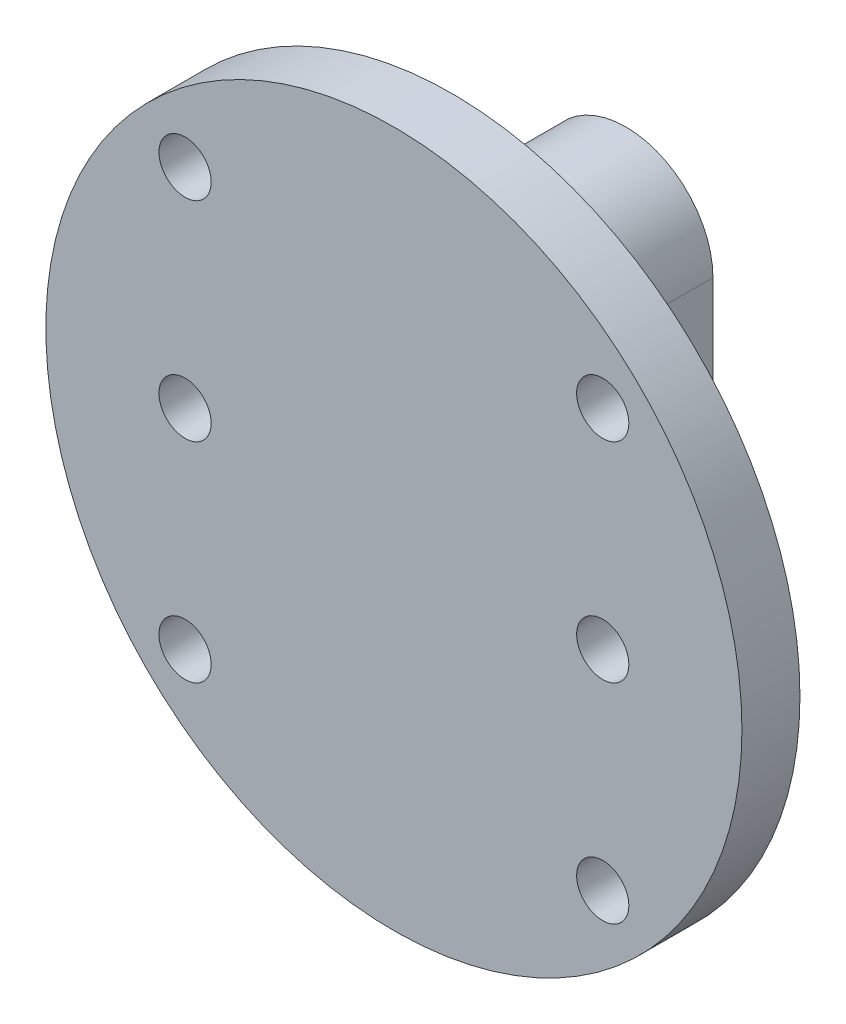
ISO-10303-21;
HEADER;
FILE_DESCRIPTION(('STEP AP214'),'2;1');
FILE_NAME('part.step','',(''),(''),'','','');
FILE_SCHEMA(('AUTOMOTIVE_DESIGN { 1 0 10303 214 1 1 1 1 }'));
ENDSEC;
DATA;
#1=APPLICATION_CONTEXT('core data for automotive mechanical design processes');
#2=APPLICATION_PROTOCOL_DEFINITION('international standard','automotive_design',2000,#1);
#3=PRODUCT_CONTEXT('',#1,'mechanical');
#4=PRODUCT('Part','Part','',(#3));
#5=PRODUCT_RELATED_PRODUCT_CATEGORY('part','',(#4));
#6=PRODUCT_DEFINITION_FORMATION('','',#4);
#7=PRODUCT_DEFINITION_CONTEXT('part definition',#1,'design');
#8=PRODUCT_DEFINITION('design','',#6,#7);
#9=PRODUCT_DEFINITION_SHAPE('','',#8);
#10=(LENGTH_UNIT() NAMED_UNIT(*) SI_UNIT(.MILLI.,.METRE.));
#11=(NAMED_UNIT(*) PLANE_ANGLE_UNIT() SI_UNIT($,.RADIAN.));
#12=(NAMED_UNIT(*) SI_UNIT($,.STERADIAN.) SOLID_ANGLE_UNIT());
#13=UNCERTAINTY_MEASURE_WITH_UNIT(LENGTH_MEASURE(1.E-05),#10,'distance_accuracy_value','');
#14=(GEOMETRIC_REPRESENTATION_CONTEXT(3) GLOBAL_UNCERTAINTY_ASSIGNED_CONTEXT((#13)) GLOBAL_UNIT_ASSIGNED_CONTEXT((#10,
#11,#12)) REPRESENTATION_CONTEXT('',''));
#15=CARTESIAN_POINT('',(0.,0.,0.));
#16=DIRECTION('',(0.,0.,1.));
#17=DIRECTION('',(1.,0.,0.));
#18=AXIS2_PLACEMENT_3D('',#15,#16,#17);
#19=CARTESIAN_POINT('',(0.,0.,5.));
#20=DIRECTION('',(0.,0.,1.));
#21=DIRECTION('',(1.,0.,0.));
#22=AXIS2_PLACEMENT_3D('',#19,#20,#21);
#23=PLANE('',#22);
#24=CARTESIAN_POINT('',(18.,-18.,5.));
#25=DIRECTION('',(0.,0.,1.));
#26=DIRECTION('',(1.,0.,0.));
#27=AXIS2_PLACEMENT_3D('',#24,#25,#26);
#28=CIRCLE('',#27,2.25);
#29=CARTESIAN_POINT('',(20.25,-18.,5.));
#30=VERTEX_POINT('',#29);
#31=EDGE_CURVE('E111',#30,#30,#28,.T.);
#32=ORIENTED_EDGE('',*,*,#31,.F.);
#33=EDGE_LOOP('',(#32));
#34=FACE_BOUND('',#33,.T.);
#35=CARTESIAN_POINT('',(-18.,18.,5.));
#36=DIRECTION('',(0.,0.,1.));
#37=DIRECTION('',(1.,0.,0.));
#38=AXIS2_PLACEMENT_3D('',#35,#36,#37);
#39=CIRCLE('',#38,2.25);
#40=CARTESIAN_POINT('',(-15.75,18.,5.));
#41=VERTEX_POINT('',#40);
#42=EDGE_CURVE('E123',#41,#41,#39,.T.);
#43=ORIENTED_EDGE('',*,*,#42,.F.);
#44=EDGE_LOOP('',(#43));
#45=FACE_BOUND('',#44,.T.);
#46=CARTESIAN_POINT('',(-18.,0.,5.));
#47=DIRECTION('',(0.,0.,1.));
#48=DIRECTION('',(1.,0.,0.));
#49=AXIS2_PLACEMENT_3D('',#46,#47,#48);
#50=CIRCLE('',#49,2.25);
#51=CARTESIAN_POINT('',(-15.75,0.,5.));
#52=VERTEX_POINT('',#51);
#53=EDGE_CURVE('E135',#52,#52,#50,.T.);
#54=ORIENTED_EDGE('',*,*,#53,.F.);
#55=EDGE_LOOP('',(#54));
#56=FACE_BOUND('',#55,.T.);
#57=CARTESIAN_POINT('',(0.,0.,5.));
#58=DIRECTION('',(0.,0.,1.));
#59=DIRECTION('',(1.,0.,0.));
#60=AXIS2_PLACEMENT_3D('',#57,#58,#59);
#61=CIRCLE('',#60,30.);
#62=CARTESIAN_POINT('',(30.,0.,5.));
#63=VERTEX_POINT('',#62);
#64=EDGE_CURVE('E11',#63,#63,#61,.T.);
#65=ORIENTED_EDGE('',*,*,#64,.T.);
#66=EDGE_LOOP('',(#65));
#67=FACE_BOUND('',#66,.T.);
#68=CARTESIAN_POINT('',(18.,18.,5.));
#69=DIRECTION('',(0.,0.,1.));
#70=DIRECTION('',(1.,0.,0.));
#71=AXIS2_PLACEMENT_3D('',#68,#69,#70);
#72=CIRCLE('',#71,2.25);
#73=CARTESIAN_POINT('',(20.25,18.,5.));
#74=VERTEX_POINT('',#73);
#75=EDGE_CURVE('E129',#74,#74,#72,.T.);
#76=ORIENTED_EDGE('',*,*,#75,.F.);
#77=EDGE_LOOP('',(#76));
#78=FACE_BOUND('',#77,.T.);
#79=CARTESIAN_POINT('',(-18.,-18.,5.));
#80=DIRECTION('',(0.,0.,1.));
#81=DIRECTION('',(1.,0.,0.));
#82=AXIS2_PLACEMENT_3D('',#79,#80,#81);
#83=CIRCLE('',#82,2.25);
#84=CARTESIAN_POINT('',(-15.75,-18.,5.));
#85=VERTEX_POINT('',#84);
#86=EDGE_CURVE('E117',#85,#85,#83,.T.);
#87=ORIENTED_EDGE('',*,*,#86,.F.);
#88=EDGE_LOOP('',(#87));
#89=FACE_BOUND('',#88,.T.);
#90=CARTESIAN_POINT('',(18.,0.,5.));
#91=DIRECTION('',(0.,0.,1.));
#92=DIRECTION('',(1.,0.,0.));
#93=AXIS2_PLACEMENT_3D('',#90,#91,#92);
#94=CIRCLE('',#93,2.25);
#95=CARTESIAN_POINT('',(20.25,0.,5.));
#96=VERTEX_POINT('',#95);
#97=EDGE_CURVE('E102',#96,#96,#94,.T.);
#98=ORIENTED_EDGE('',*,*,#97,.F.);
#99=EDGE_LOOP('',(#98));
#100=FACE_BOUND('',#99,.T.);
#101=ADVANCED_FACE('F37',(#34,#45,#56,#67,#78,#89,#100),#23,.T.);
#102=CARTESIAN_POINT('',(0.,0.,0.));
#103=DIRECTION('',(0.,0.,1.));
#104=DIRECTION('',(1.,0.,0.));
#105=AXIS2_PLACEMENT_3D('',#102,#103,#104);
#106=PLANE('',#105);
#107=CARTESIAN_POINT('',(0.,12.5,0.));
#108=DIRECTION('',(0.,0.,-1.));
#109=DIRECTION('',(-1.,0.,0.));
#110=AXIS2_PLACEMENT_3D('',#107,#108,#109);
#111=CIRCLE('',#110,7.5);
#112=CARTESIAN_POINT('',(-7.5,12.5,0.));
#113=VERTEX_POINT('',#112);
#114=CARTESIAN_POINT('',(7.50000000000001,12.5,0.));
#115=VERTEX_POINT('',#114);
#116=EDGE_CURVE('E52',#113,#115,#111,.T.);
#117=ORIENTED_EDGE('',*,*,#116,.F.);
#118=DIRECTION('',(0.,1.,0.));
#119=VECTOR('',#118,1.);
#120=CARTESIAN_POINT('',(-7.5,12.5,0.));
#121=LINE('',#120,#119);
#122=CARTESIAN_POINT('',(-7.5,-12.5,0.));
#123=VERTEX_POINT('',#122);
#124=EDGE_CURVE('E56',#123,#113,#121,.T.);
#125=ORIENTED_EDGE('',*,*,#124,.F.);
#126=CARTESIAN_POINT('',(0.,-12.5,0.));
#127=DIRECTION('',(0.,0.,-1.));
#128=DIRECTION('',(-1.,0.,0.));
#129=AXIS2_PLACEMENT_3D('',#126,#127,#128);
#130=CIRCLE('',#129,7.5);
#131=CARTESIAN_POINT('',(7.5,-12.5,0.));
#132=VERTEX_POINT('',#131);
#133=EDGE_CURVE('E337',#132,#123,#130,.T.);
#134=ORIENTED_EDGE('',*,*,#133,.F.);
#135=DIRECTION('',(0.,-1.,0.));
#136=VECTOR('',#135,1.);
#137=CARTESIAN_POINT('',(7.50000000000001,12.5,0.));
#138=LINE('',#137,#136);
#139=EDGE_CURVE('E335',#115,#132,#138,.T.);
#140=ORIENTED_EDGE('',*,*,#139,.F.);
#141=EDGE_LOOP('',(#117,#125,#134,#140));
#142=FACE_BOUND('',#141,.T.);
#143=CARTESIAN_POINT('',(0.,0.,0.));
#144=DIRECTION('',(0.,0.,1.));
#145=DIRECTION('',(1.,0.,0.));
#146=AXIS2_PLACEMENT_3D('',#143,#144,#145);
#147=CIRCLE('',#146,30.);
#148=CARTESIAN_POINT('',(30.,0.,0.));
#149=VERTEX_POINT('',#148);
#150=EDGE_CURVE('E41',#149,#149,#147,.T.);
#151=ORIENTED_EDGE('',*,*,#150,.F.);
#152=EDGE_LOOP('',(#151));
#153=FACE_BOUND('',#152,.T.);
#154=CARTESIAN_POINT('',(-18.,0.,0.));
#155=DIRECTION('',(0.,0.,1.));
#156=DIRECTION('',(1.,0.,0.));
#157=AXIS2_PLACEMENT_3D('',#154,#155,#156);
#158=CIRCLE('',#157,2.25);
#159=CARTESIAN_POINT('',(-15.75,0.,0.));
#160=VERTEX_POINT('',#159);
#161=EDGE_CURVE('E132',#160,#160,#158,.T.);
#162=ORIENTED_EDGE('',*,*,#161,.T.);
#163=EDGE_LOOP('',(#162));
#164=FACE_BOUND('',#163,.T.);
#165=CARTESIAN_POINT('',(18.,18.,0.));
#166=DIRECTION('',(0.,0.,1.));
#167=DIRECTION('',(1.,0.,0.));
#168=AXIS2_PLACEMENT_3D('',#165,#166,#167);
#169=CIRCLE('',#168,2.25);
#170=CARTESIAN_POINT('',(20.25,18.,0.));
#171=VERTEX_POINT('',#170);
#172=EDGE_CURVE('E126',#171,#171,#169,.T.);
#173=ORIENTED_EDGE('',*,*,#172,.T.);
#174=EDGE_LOOP('',(#173));
#175=FACE_BOUND('',#174,.T.);
#176=CARTESIAN_POINT('',(-18.,18.,0.));
#177=DIRECTION('',(0.,0.,1.));
#178=DIRECTION('',(1.,0.,0.));
#179=AXIS2_PLACEMENT_3D('',#176,#177,#178);
#180=CIRCLE('',#179,2.25);
#181=CARTESIAN_POINT('',(-15.75,18.,0.));
#182=VERTEX_POINT('',#181);
#183=EDGE_CURVE('E120',#182,#182,#180,.T.);
#184=ORIENTED_EDGE('',*,*,#183,.T.);
#185=EDGE_LOOP('',(#184));
#186=FACE_BOUND('',#185,.T.);
#187=CARTESIAN_POINT('',(-18.,-18.,0.));
#188=DIRECTION('',(0.,0.,1.));
#189=DIRECTION('',(1.,0.,0.));
#190=AXIS2_PLACEMENT_3D('',#187,#188,#189);
#191=CIRCLE('',#190,2.25);
#192=CARTESIAN_POINT('',(-15.75,-18.,0.));
#193=VERTEX_POINT('',#192);
#194=EDGE_CURVE('E114',#193,#193,#191,.T.);
#195=ORIENTED_EDGE('',*,*,#194,.T.);
#196=EDGE_LOOP('',(#195));
#197=FACE_BOUND('',#196,.T.);
#198=CARTESIAN_POINT('',(18.,-18.,0.));
#199=DIRECTION('',(0.,0.,1.));
#200=DIRECTION('',(1.,0.,0.));
#201=AXIS2_PLACEMENT_3D('',#198,#199,#200);
#202=CIRCLE('',#201,2.25);
#203=CARTESIAN_POINT('',(20.25,-18.,0.));
#204=VERTEX_POINT('',#203);
#205=EDGE_CURVE('E109',#204,#204,#202,.T.);
#206=ORIENTED_EDGE('',*,*,#205,.T.);
#207=EDGE_LOOP('',(#206));
#208=FACE_BOUND('',#207,.T.);
#209=CARTESIAN_POINT('',(18.,0.,0.));
#210=DIRECTION('',(0.,0.,1.));
#211=DIRECTION('',(1.,0.,0.));
#212=AXIS2_PLACEMENT_3D('',#209,#210,#211);
#213=CIRCLE('',#212,2.25);
#214=CARTESIAN_POINT('',(20.25,0.,0.));
#215=VERTEX_POINT('',#214);
#216=EDGE_CURVE('E99',#215,#215,#213,.T.);
#217=ORIENTED_EDGE('',*,*,#216,.T.);
#218=EDGE_LOOP('',(#217));
#219=FACE_BOUND('',#218,.T.);
#220=ADVANCED_FACE('F141',(#142,#153,#164,#175,#186,#197,#208,#219),#106,.F.);
#221=CARTESIAN_POINT('',(0.,0.,5.));
#222=DIRECTION('',(0.,0.,-1.));
#223=DIRECTION('',(-1.,0.,0.));
#224=AXIS2_PLACEMENT_3D('',#221,#222,#223);
#225=CYLINDRICAL_SURFACE('',#224,30.);
#226=ORIENTED_EDGE('',*,*,#64,.F.);
#227=EDGE_LOOP('',(#226));
#228=FACE_BOUND('',#227,.T.);
#229=ORIENTED_EDGE('',*,*,#150,.T.);
#230=EDGE_LOOP('',(#229));
#231=FACE_BOUND('',#230,.T.);
#232=ADVANCED_FACE('F39',(#228,#231),#225,.T.);
#233=CARTESIAN_POINT('',(-18.,0.,5.));
#234=DIRECTION('',(0.,0.,-1.));
#235=DIRECTION('',(-1.,0.,0.));
#236=AXIS2_PLACEMENT_3D('',#233,#234,#235);
#237=CYLINDRICAL_SURFACE('',#236,2.25);
#238=ORIENTED_EDGE('',*,*,#53,.T.);
#239=EDGE_LOOP('',(#238));
#240=FACE_BOUND('',#239,.T.);
#241=ORIENTED_EDGE('',*,*,#161,.F.);
#242=EDGE_LOOP('',(#241));
#243=FACE_BOUND('',#242,.T.);
#244=ADVANCED_FACE('F144',(#240,#243),#237,.F.);
#245=CARTESIAN_POINT('',(18.,18.,5.));
#246=DIRECTION('',(0.,0.,-1.));
#247=DIRECTION('',(-1.,0.,0.));
#248=AXIS2_PLACEMENT_3D('',#245,#246,#247);
#249=CYLINDRICAL_SURFACE('',#248,2.25);
#250=ORIENTED_EDGE('',*,*,#75,.T.);
#251=EDGE_LOOP('',(#250));
#252=FACE_BOUND('',#251,.T.);
#253=ORIENTED_EDGE('',*,*,#172,.F.);
#254=EDGE_LOOP('',(#253));
#255=FACE_BOUND('',#254,.T.);
#256=ADVANCED_FACE('F146',(#252,#255),#249,.F.);
#257=CARTESIAN_POINT('',(-18.,18.,5.));
#258=DIRECTION('',(0.,0.,-1.));
#259=DIRECTION('',(-1.,0.,0.));
#260=AXIS2_PLACEMENT_3D('',#257,#258,#259);
#261=CYLINDRICAL_SURFACE('',#260,2.25);
#262=ORIENTED_EDGE('',*,*,#42,.T.);
#263=EDGE_LOOP('',(#262));
#264=FACE_BOUND('',#263,.T.);
#265=ORIENTED_EDGE('',*,*,#183,.F.);
#266=EDGE_LOOP('',(#265));
#267=FACE_BOUND('',#266,.T.);
#268=ADVANCED_FACE('F153',(#264,#267),#261,.F.);
#269=CARTESIAN_POINT('',(-18.,-18.,5.));
#270=DIRECTION('',(0.,0.,-1.));
#271=DIRECTION('',(-1.,0.,0.));
#272=AXIS2_PLACEMENT_3D('',#269,#270,#271);
#273=CYLINDRICAL_SURFACE('',#272,2.25);
#274=ORIENTED_EDGE('',*,*,#86,.T.);
#275=EDGE_LOOP('',(#274));
#276=FACE_BOUND('',#275,.T.);
#277=ORIENTED_EDGE('',*,*,#194,.F.);
#278=EDGE_LOOP('',(#277));
#279=FACE_BOUND('',#278,.T.);
#280=ADVANCED_FACE('F192',(#276,#279),#273,.F.);
#281=CARTESIAN_POINT('',(18.,-18.,5.));
#282=DIRECTION('',(0.,0.,-1.));
#283=DIRECTION('',(-1.,0.,0.));
#284=AXIS2_PLACEMENT_3D('',#281,#282,#283);
#285=CYLINDRICAL_SURFACE('',#284,2.25);
#286=ORIENTED_EDGE('',*,*,#31,.T.);
#287=EDGE_LOOP('',(#286));
#288=FACE_BOUND('',#287,.T.);
#289=ORIENTED_EDGE('',*,*,#205,.F.);
#290=EDGE_LOOP('',(#289));
#291=FACE_BOUND('',#290,.T.);
#292=ADVANCED_FACE('F182',(#288,#291),#285,.F.);
#293=CARTESIAN_POINT('',(18.,0.,5.));
#294=DIRECTION('',(0.,0.,-1.));
#295=DIRECTION('',(-1.,0.,0.));
#296=AXIS2_PLACEMENT_3D('',#293,#294,#295);
#297=CYLINDRICAL_SURFACE('',#296,2.25);
#298=ORIENTED_EDGE('',*,*,#97,.T.);
#299=EDGE_LOOP('',(#298));
#300=FACE_BOUND('',#299,.T.);
#301=ORIENTED_EDGE('',*,*,#216,.F.);
#302=EDGE_LOOP('',(#301));
#303=FACE_BOUND('',#302,.T.);
#304=ADVANCED_FACE('F179',(#300,#303),#297,.F.);
#305=CARTESIAN_POINT('',(0.,12.5,-15.));
#306=DIRECTION('',(0.,0.,-1.));
#307=DIRECTION('',(-1.,0.,0.));
#308=AXIS2_PLACEMENT_3D('',#305,#306,#307);
#309=PLANE('',#308);
#310=CARTESIAN_POINT('',(0.,12.5,-15.));
#311=DIRECTION('',(0.,0.,-1.));
#312=DIRECTION('',(-1.,0.,0.));
#313=AXIS2_PLACEMENT_3D('',#310,#311,#312);
#314=CIRCLE('',#313,2.8);
#315=CARTESIAN_POINT('',(-2.8,12.5,-15.));
#316=VERTEX_POINT('',#315);
#317=EDGE_CURVE('E326',#316,#316,#314,.T.);
#318=ORIENTED_EDGE('',*,*,#317,.F.);
#319=EDGE_LOOP('',(#318));
#320=FACE_BOUND('',#319,.T.);
#321=CARTESIAN_POINT('',(0.,12.5,-15.));
#322=DIRECTION('',(0.,0.,-1.));
#323=DIRECTION('',(-1.,0.,0.));
#324=AXIS2_PLACEMENT_3D('',#321,#322,#323);
#325=CIRCLE('',#324,7.5);
#326=CARTESIAN_POINT('',(-7.5,12.5,-15.));
#327=VERTEX_POINT('',#326);
#328=CARTESIAN_POINT('',(7.50000000000001,12.5,-15.));
#329=VERTEX_POINT('',#328);
#330=EDGE_CURVE('E87',#327,#329,#325,.T.);
#331=ORIENTED_EDGE('',*,*,#330,.T.);
#332=DIRECTION('',(0.,-1.,0.));
#333=VECTOR('',#332,1.);
#334=CARTESIAN_POINT('',(7.50000000000001,12.5,-15.));
#335=LINE('',#334,#333);
#336=CARTESIAN_POINT('',(7.5,-12.5,-15.));
#337=VERTEX_POINT('',#336);
#338=EDGE_CURVE('E76',#329,#337,#335,.T.);
#339=ORIENTED_EDGE('',*,*,#338,.T.);
#340=CARTESIAN_POINT('',(0.,-12.5,-15.));
#341=DIRECTION('',(0.,0.,-1.));
#342=DIRECTION('',(-1.,0.,0.));
#343=AXIS2_PLACEMENT_3D('',#340,#341,#342);
#344=CIRCLE('',#343,7.5);
#345=CARTESIAN_POINT('',(-7.5,-12.5,-15.));
#346=VERTEX_POINT('',#345);
#347=EDGE_CURVE('E86',#337,#346,#344,.T.);
#348=ORIENTED_EDGE('',*,*,#347,.T.);
#349=DIRECTION('',(0.,1.,0.));
#350=VECTOR('',#349,1.);
#351=CARTESIAN_POINT('',(-7.5,12.5,-15.));
#352=LINE('',#351,#350);
#353=EDGE_CURVE('E93',#346,#327,#352,.T.);
#354=ORIENTED_EDGE('',*,*,#353,.T.);
#355=EDGE_LOOP('',(#331,#339,#348,#354));
#356=FACE_BOUND('',#355,.T.);
#357=CARTESIAN_POINT('',(0.,-12.5,-15.));
#358=DIRECTION('',(0.,0.,-1.));
#359=DIRECTION('',(-1.,0.,0.));
#360=AXIS2_PLACEMENT_3D('',#357,#358,#359);
#361=CIRCLE('',#360,2.8);
#362=CARTESIAN_POINT('',(-2.8,-12.5,-15.));
#363=VERTEX_POINT('',#362);
#364=EDGE_CURVE('E320',#363,#363,#361,.T.);
#365=ORIENTED_EDGE('',*,*,#364,.F.);
#366=EDGE_LOOP('',(#365));
#367=FACE_BOUND('',#366,.T.);
#368=ADVANCED_FACE('F90',(#320,#356,#367),#309,.T.);
#369=CARTESIAN_POINT('',(0.,12.5,-15.));
#370=DIRECTION('',(0.,0.,1.));
#371=DIRECTION('',(1.,0.,0.));
#372=AXIS2_PLACEMENT_3D('',#369,#370,#371);
#373=CYLINDRICAL_SURFACE('',#372,7.5);
#374=ORIENTED_EDGE('',*,*,#116,.T.);
#375=DIRECTION('',(0.,0.,1.));
#376=VECTOR('',#375,1.);
#377=CARTESIAN_POINT('',(7.50000000000001,12.5,-15.));
#378=LINE('',#377,#376);
#379=EDGE_CURVE('E81',#329,#115,#378,.T.);
#380=ORIENTED_EDGE('',*,*,#379,.F.);
#381=ORIENTED_EDGE('',*,*,#330,.F.);
#382=DIRECTION('',(0.,0.,1.));
#383=VECTOR('',#382,1.);
#384=CARTESIAN_POINT('',(-7.5,12.5,-15.));
#385=LINE('',#384,#383);
#386=EDGE_CURVE('E333',#327,#113,#385,.T.);
#387=ORIENTED_EDGE('',*,*,#386,.T.);
#388=EDGE_LOOP('',(#374,#380,#381,#387));
#389=FACE_BOUND('',#388,.T.);
#390=ADVANCED_FACE('F98',(#389),#373,.T.);
#391=CARTESIAN_POINT('',(7.50000000000001,12.5,-15.));
#392=DIRECTION('',(-1.,0.,0.));
#393=DIRECTION('',(0.,-1.,0.));
#394=AXIS2_PLACEMENT_3D('',#391,#392,#393);
#395=PLANE('',#394);
#396=ORIENTED_EDGE('',*,*,#139,.T.);
#397=DIRECTION('',(0.,0.,1.));
#398=VECTOR('',#397,1.);
#399=CARTESIAN_POINT('',(7.5,-12.5,-15.));
#400=LINE('',#399,#398);
#401=EDGE_CURVE('E83',#337,#132,#400,.T.);
#402=ORIENTED_EDGE('',*,*,#401,.F.);
#403=ORIENTED_EDGE('',*,*,#338,.F.);
#404=ORIENTED_EDGE('',*,*,#379,.T.);
#405=EDGE_LOOP('',(#396,#402,#403,#404));
#406=FACE_BOUND('',#405,.T.);
#407=ADVANCED_FACE('F79',(#406),#395,.F.);
#408=CARTESIAN_POINT('',(0.,-12.5,-15.));
#409=DIRECTION('',(0.,0.,1.));
#410=DIRECTION('',(1.,0.,0.));
#411=AXIS2_PLACEMENT_3D('',#408,#409,#410);
#412=CYLINDRICAL_SURFACE('',#411,7.5);
#413=ORIENTED_EDGE('',*,*,#133,.T.);
#414=DIRECTION('',(0.,0.,1.));
#415=VECTOR('',#414,1.);
#416=CARTESIAN_POINT('',(-7.5,-12.5,-15.));
#417=LINE('',#416,#415);
#418=EDGE_CURVE('E104',#346,#123,#417,.T.);
#419=ORIENTED_EDGE('',*,*,#418,.F.);
#420=ORIENTED_EDGE('',*,*,#347,.F.);
#421=ORIENTED_EDGE('',*,*,#401,.T.);
#422=EDGE_LOOP('',(#413,#419,#420,#421));
#423=FACE_BOUND('',#422,.T.);
#424=ADVANCED_FACE('F260',(#423),#412,.T.);
#425=CARTESIAN_POINT('',(-7.5,12.5,-15.));
#426=DIRECTION('',(1.,0.,0.));
#427=DIRECTION('',(0.,1.,0.));
#428=AXIS2_PLACEMENT_3D('',#425,#426,#427);
#429=PLANE('',#428);
#430=ORIENTED_EDGE('',*,*,#124,.T.);
#431=ORIENTED_EDGE('',*,*,#386,.F.);
#432=ORIENTED_EDGE('',*,*,#353,.F.);
#433=ORIENTED_EDGE('',*,*,#418,.T.);
#434=EDGE_LOOP('',(#430,#431,#432,#433));
#435=FACE_BOUND('',#434,.T.);
#436=ADVANCED_FACE('F268',(#435),#429,.F.);
#437=CARTESIAN_POINT('',(0.,12.5,-15.));
#438=DIRECTION('',(0.,0.,1.));
#439=DIRECTION('',(1.,0.,0.));
#440=AXIS2_PLACEMENT_3D('',#437,#438,#439);
#441=CYLINDRICAL_SURFACE('',#440,2.8);
#442=ORIENTED_EDGE('',*,*,#317,.T.);
#443=EDGE_LOOP('',(#442));
#444=FACE_BOUND('',#443,.T.);
#445=CARTESIAN_POINT('',(0.,12.5,0.));
#446=DIRECTION('',(0.,0.,-1.));
#447=DIRECTION('',(-1.,0.,0.));
#448=AXIS2_PLACEMENT_3D('',#445,#446,#447);
#449=CIRCLE('',#448,2.8);
#450=CARTESIAN_POINT('',(-2.8,12.5,0.));
#451=VERTEX_POINT('',#450);
#452=EDGE_CURVE('E323',#451,#451,#449,.T.);
#453=ORIENTED_EDGE('',*,*,#452,.F.);
#454=EDGE_LOOP('',(#453));
#455=FACE_BOUND('',#454,.T.);
#456=ADVANCED_FACE('F278',(#444,#455),#441,.F.);
#457=CARTESIAN_POINT('',(0.,-12.5,-15.));
#458=DIRECTION('',(0.,0.,1.));
#459=DIRECTION('',(1.,0.,0.));
#460=AXIS2_PLACEMENT_3D('',#457,#458,#459);
#461=CYLINDRICAL_SURFACE('',#460,2.8);
#462=ORIENTED_EDGE('',*,*,#364,.T.);
#463=EDGE_LOOP('',(#462));
#464=FACE_BOUND('',#463,.T.);
#465=CARTESIAN_POINT('',(0.,-12.5,0.));
#466=DIRECTION('',(0.,0.,-1.));
#467=DIRECTION('',(-1.,0.,0.));
#468=AXIS2_PLACEMENT_3D('',#465,#466,#467);
#469=CIRCLE('',#468,2.8);
#470=CARTESIAN_POINT('',(-2.8,-12.5,0.));
#471=VERTEX_POINT('',#470);
#472=EDGE_CURVE('E318',#471,#471,#469,.T.);
#473=ORIENTED_EDGE('',*,*,#472,.F.);
#474=EDGE_LOOP('',(#473));
#475=FACE_BOUND('',#474,.T.);
#476=ADVANCED_FACE('F288',(#464,#475),#461,.F.);
#477=ORIENTED_EDGE('',*,*,#452,.T.);
#478=EDGE_LOOP('',(#477));
#479=FACE_BOUND('',#478,.T.);
#480=ADVANCED_FACE('F163',(#479),#106,.F.);
#481=ORIENTED_EDGE('',*,*,#472,.T.);
#482=EDGE_LOOP('',(#481));
#483=FACE_BOUND('',#482,.T.);
#484=ADVANCED_FACE('F164',(#483),#106,.F.);
#485=CLOSED_SHELL('',(#101,#220,#232,#244,#256,#268,#280,#292,#304,#368,#390,#407,#424,#436,
#456,#476,#480,#484));
#486=MANIFOLD_SOLID_BREP('B2',#485);
#487=ADVANCED_BREP_SHAPE_REPRESENTATION('',(#18,#486),#14);
#488=SHAPE_DEFINITION_REPRESENTATION(#9,#487);
ENDSEC;
END-ISO-10303-21;
